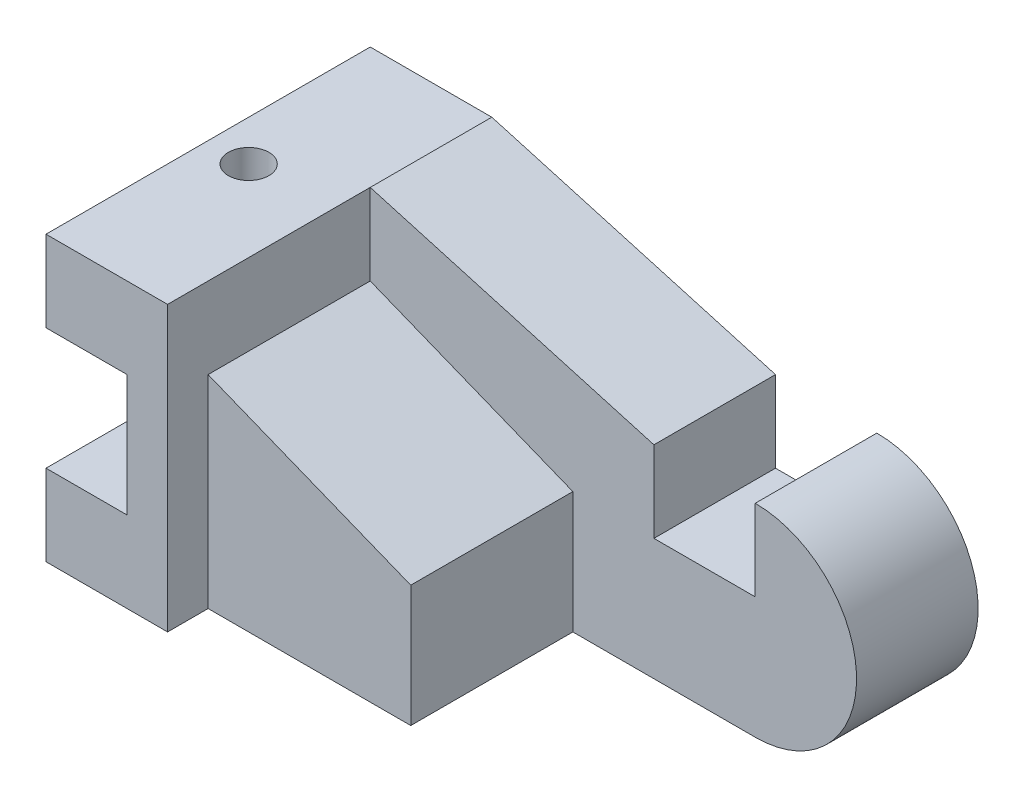
ISO-10303-21;
HEADER;
FILE_DESCRIPTION(('STEP AP214'),'2;1');
FILE_NAME('part.step','',(''),(''),'','','');
FILE_SCHEMA(('AUTOMOTIVE_DESIGN { 1 0 10303 214 1 1 1 1 }'));
ENDSEC;
DATA;
#1=APPLICATION_CONTEXT('core data for automotive mechanical design processes');
#2=APPLICATION_PROTOCOL_DEFINITION('international standard','automotive_design',2000,#1);
#3=PRODUCT_CONTEXT('',#1,'mechanical');
#4=PRODUCT('Part','Part','',(#3));
#5=PRODUCT_RELATED_PRODUCT_CATEGORY('part','',(#4));
#6=PRODUCT_DEFINITION_FORMATION('','',#4);
#7=PRODUCT_DEFINITION_CONTEXT('part definition',#1,'design');
#8=PRODUCT_DEFINITION('design','',#6,#7);
#9=PRODUCT_DEFINITION_SHAPE('','',#8);
#10=(LENGTH_UNIT() NAMED_UNIT(*) SI_UNIT(.MILLI.,.METRE.));
#11=(NAMED_UNIT(*) PLANE_ANGLE_UNIT() SI_UNIT($,.RADIAN.));
#12=(NAMED_UNIT(*) SI_UNIT($,.STERADIAN.) SOLID_ANGLE_UNIT());
#13=UNCERTAINTY_MEASURE_WITH_UNIT(LENGTH_MEASURE(1.E-05),#10,'distance_accuracy_value','');
#14=(GEOMETRIC_REPRESENTATION_CONTEXT(3) GLOBAL_UNCERTAINTY_ASSIGNED_CONTEXT((#13)) GLOBAL_UNIT_ASSIGNED_CONTEXT((#10,
#11,#12)) REPRESENTATION_CONTEXT('',''));
#15=CARTESIAN_POINT('',(0.,0.,0.));
#16=DIRECTION('',(0.,0.,1.));
#17=DIRECTION('',(1.,0.,0.));
#18=AXIS2_PLACEMENT_3D('',#15,#16,#17);
#19=CARTESIAN_POINT('',(0.,70.,40.));
#20=DIRECTION('',(0.,-1.,0.));
#21=DIRECTION('',(0.,0.,-1.));
#22=AXIS2_PLACEMENT_3D('',#19,#20,#21);
#23=PLANE('',#22);
#24=DIRECTION('',(-1.,0.,0.));
#25=VECTOR('',#24,1.);
#26=CARTESIAN_POINT('',(0.,70.,-40.));
#27=LINE('',#26,#25);
#28=CARTESIAN_POINT('',(0.,70.,-40.));
#29=VERTEX_POINT('',#28);
#30=CARTESIAN_POINT('',(-30.,70.,-40.));
#31=VERTEX_POINT('',#30);
#32=EDGE_CURVE('E234',#29,#31,#27,.T.);
#33=ORIENTED_EDGE('',*,*,#32,.T.);
#34=DIRECTION('',(0.,0.,-1.));
#35=VECTOR('',#34,1.);
#36=CARTESIAN_POINT('',(-30.,70.,40.));
#37=LINE('',#36,#35);
#38=CARTESIAN_POINT('',(-30.,70.,40.));
#39=VERTEX_POINT('',#38);
#40=EDGE_CURVE('E49',#39,#31,#37,.T.);
#41=ORIENTED_EDGE('',*,*,#40,.F.);
#42=DIRECTION('',(-1.,0.,0.));
#43=VECTOR('',#42,1.);
#44=CARTESIAN_POINT('',(0.,70.,40.));
#45=LINE('',#44,#43);
#46=CARTESIAN_POINT('',(0.,70.,40.));
#47=VERTEX_POINT('',#46);
#48=EDGE_CURVE('E238',#47,#39,#45,.T.);
#49=ORIENTED_EDGE('',*,*,#48,.F.);
#50=DIRECTION('',(0.,0.,-1.));
#51=VECTOR('',#50,1.);
#52=CARTESIAN_POINT('',(0.,70.,40.));
#53=LINE('',#52,#51);
#54=CARTESIAN_POINT('',(0.,70.,-10.));
#55=VERTEX_POINT('',#54);
#56=EDGE_CURVE('E11',#47,#55,#53,.T.);
#57=ORIENTED_EDGE('',*,*,#56,.T.);
#58=DIRECTION('',(0.,0.,-1.));
#59=VECTOR('',#58,1.);
#60=CARTESIAN_POINT('',(0.,70.,-10.));
#61=LINE('',#60,#59);
#62=EDGE_CURVE('E208',#55,#29,#61,.T.);
#63=ORIENTED_EDGE('',*,*,#62,.T.);
#64=EDGE_LOOP('',(#33,#41,#49,#57,#63));
#65=FACE_BOUND('',#64,.T.);
#66=CARTESIAN_POINT('',(-20.,70.,0.));
#67=DIRECTION('',(0.,1.,0.));
#68=DIRECTION('',(0.,0.,1.));
#69=AXIS2_PLACEMENT_3D('',#66,#67,#68);
#70=CIRCLE('',#69,4.99999999999999);
#71=CARTESIAN_POINT('',(-20.,70.,4.99999999999999));
#72=VERTEX_POINT('',#71);
#73=EDGE_CURVE('E368',#72,#72,#70,.T.);
#74=ORIENTED_EDGE('',*,*,#73,.F.);
#75=EDGE_LOOP('',(#74));
#76=FACE_BOUND('',#75,.T.);
#77=ADVANCED_FACE('F41',(#65,#76),#23,.F.);
#78=CARTESIAN_POINT('',(0.,0.,40.));
#79=DIRECTION('',(-1.,0.,0.));
#80=DIRECTION('',(0.,0.,1.));
#81=AXIS2_PLACEMENT_3D('',#78,#79,#80);
#82=PLANE('',#81);
#83=DIRECTION('',(0.,0.,-1.));
#84=VECTOR('',#83,1.);
#85=CARTESIAN_POINT('',(0.,50.,30.));
#86=LINE('',#85,#84);
#87=CARTESIAN_POINT('',(0.,50.,30.));
#88=VERTEX_POINT('',#87);
#89=CARTESIAN_POINT('',(0.,50.,-10.));
#90=VERTEX_POINT('',#89);
#91=EDGE_CURVE('E171',#88,#90,#86,.T.);
#92=ORIENTED_EDGE('',*,*,#91,.T.);
#93=DIRECTION('',(0.,1.,0.));
#94=VECTOR('',#93,1.);
#95=CARTESIAN_POINT('',(0.,0.,-10.));
#96=LINE('',#95,#94);
#97=EDGE_CURVE('E64',#90,#55,#96,.T.);
#98=ORIENTED_EDGE('',*,*,#97,.T.);
#99=ORIENTED_EDGE('',*,*,#56,.F.);
#100=DIRECTION('',(0.,1.,0.));
#101=VECTOR('',#100,1.);
#102=CARTESIAN_POINT('',(0.,0.,40.));
#103=LINE('',#102,#101);
#104=CARTESIAN_POINT('',(0.,0.,40.));
#105=VERTEX_POINT('',#104);
#106=EDGE_CURVE('E235',#105,#47,#103,.T.);
#107=ORIENTED_EDGE('',*,*,#106,.F.);
#108=DIRECTION('',(0.,0.,-1.));
#109=VECTOR('',#108,1.);
#110=CARTESIAN_POINT('',(0.,0.,40.));
#111=LINE('',#110,#109);
#112=CARTESIAN_POINT('',(0.,0.,30.));
#113=VERTEX_POINT('',#112);
#114=EDGE_CURVE('E180',#105,#113,#111,.T.);
#115=ORIENTED_EDGE('',*,*,#114,.T.);
#116=DIRECTION('',(0.,-1.,0.));
#117=VECTOR('',#116,1.);
#118=CARTESIAN_POINT('',(0.,50.,30.));
#119=LINE('',#118,#117);
#120=EDGE_CURVE('E163',#88,#113,#119,.T.);
#121=ORIENTED_EDGE('',*,*,#120,.F.);
#122=EDGE_LOOP('',(#92,#98,#99,#107,#115,#121));
#123=FACE_BOUND('',#122,.T.);
#124=ADVANCED_FACE('F43',(#123),#82,.F.);
#125=CARTESIAN_POINT('',(0.,0.,-10.));
#126=DIRECTION('',(0.,0.,1.));
#127=DIRECTION('',(1.,0.,0.));
#128=AXIS2_PLACEMENT_3D('',#125,#126,#127);
#129=PLANE('',#128);
#130=ORIENTED_EDGE('',*,*,#97,.F.);
#131=DIRECTION('',(-0.928476690885259,0.371390676354104,0.));
#132=VECTOR('',#131,1.);
#133=CARTESIAN_POINT('',(50.,30.,-10.));
#134=LINE('',#133,#132);
#135=CARTESIAN_POINT('',(50.,30.,-10.));
#136=VERTEX_POINT('',#135);
#137=EDGE_CURVE('E174',#136,#90,#134,.T.);
#138=ORIENTED_EDGE('',*,*,#137,.F.);
#139=DIRECTION('',(0.,1.,0.));
#140=VECTOR('',#139,1.);
#141=CARTESIAN_POINT('',(50.,0.,-10.));
#142=LINE('',#141,#140);
#143=CARTESIAN_POINT('',(50.,0.,-10.));
#144=VERTEX_POINT('',#143);
#145=EDGE_CURVE('E169',#144,#136,#142,.T.);
#146=ORIENTED_EDGE('',*,*,#145,.F.);
#147=DIRECTION('',(1.,0.,0.));
#148=VECTOR('',#147,1.);
#149=CARTESIAN_POINT('',(0.,0.,-10.));
#150=LINE('',#149,#148);
#151=CARTESIAN_POINT('',(95.,0.,-10.));
#152=VERTEX_POINT('',#151);
#153=EDGE_CURVE('E193',#144,#152,#150,.T.);
#154=ORIENTED_EDGE('',*,*,#153,.T.);
#155=CARTESIAN_POINT('',(95.,25.,-10.));
#156=DIRECTION('',(0.,0.,1.));
#157=DIRECTION('',(1.,0.,0.));
#158=AXIS2_PLACEMENT_3D('',#155,#156,#157);
#159=CIRCLE('',#158,25.);
#160=CARTESIAN_POINT('',(95.,50.,-10.));
#161=VERTEX_POINT('',#160);
#162=EDGE_CURVE('E195',#152,#161,#159,.T.);
#163=ORIENTED_EDGE('',*,*,#162,.T.);
#164=DIRECTION('',(0.,-1.,0.));
#165=VECTOR('',#164,1.);
#166=CARTESIAN_POINT('',(95.,0.,-10.));
#167=LINE('',#166,#165);
#168=CARTESIAN_POINT('',(95.,30.,-10.));
#169=VERTEX_POINT('',#168);
#170=EDGE_CURVE('E198',#161,#169,#167,.T.);
#171=ORIENTED_EDGE('',*,*,#170,.T.);
#172=DIRECTION('',(-1.,0.,0.));
#173=VECTOR('',#172,1.);
#174=CARTESIAN_POINT('',(0.,30.,-10.));
#175=LINE('',#174,#173);
#176=CARTESIAN_POINT('',(70.,30.,-10.));
#177=VERTEX_POINT('',#176);
#178=EDGE_CURVE('E200',#169,#177,#175,.T.);
#179=ORIENTED_EDGE('',*,*,#178,.T.);
#180=DIRECTION('',(0.,1.,0.));
#181=VECTOR('',#180,1.);
#182=CARTESIAN_POINT('',(70.,0.,-10.));
#183=LINE('',#182,#181);
#184=CARTESIAN_POINT('',(70.,50.,-10.));
#185=VERTEX_POINT('',#184);
#186=EDGE_CURVE('E202',#177,#185,#183,.T.);
#187=ORIENTED_EDGE('',*,*,#186,.T.);
#188=DIRECTION('',(-0.961523947640823,0.274721127897378,0.));
#189=VECTOR('',#188,1.);
#190=CARTESIAN_POINT('',(18.4905660377359,64.7169811320755,-10.));
#191=LINE('',#190,#189);
#192=EDGE_CURVE('E204',#185,#55,#191,.T.);
#193=ORIENTED_EDGE('',*,*,#192,.T.);
#194=EDGE_LOOP('',(#130,#138,#146,#154,#163,#171,#179,#187,#193));
#195=FACE_BOUND('',#194,.T.);
#196=ADVANCED_FACE('F312',(#195),#129,.T.);
#197=CARTESIAN_POINT('',(-30.,0.,40.));
#198=DIRECTION('',(1.,0.,0.));
#199=DIRECTION('',(0.,1.,0.));
#200=AXIS2_PLACEMENT_3D('',#197,#198,#199);
#201=PLANE('',#200);
#202=DIRECTION('',(0.,-1.,0.));
#203=VECTOR('',#202,1.);
#204=CARTESIAN_POINT('',(-30.,0.,-40.));
#205=LINE('',#204,#203);
#206=CARTESIAN_POINT('',(-30.,50.,-40.));
#207=VERTEX_POINT('',#206);
#208=EDGE_CURVE('E254',#31,#207,#205,.T.);
#209=ORIENTED_EDGE('',*,*,#208,.T.);
#210=DIRECTION('',(0.,0.,-1.));
#211=VECTOR('',#210,1.);
#212=CARTESIAN_POINT('',(-30.,50.,40.));
#213=LINE('',#212,#211);
#214=CARTESIAN_POINT('',(-30.,50.,40.));
#215=VERTEX_POINT('',#214);
#216=EDGE_CURVE('E278',#215,#207,#213,.T.);
#217=ORIENTED_EDGE('',*,*,#216,.F.);
#218=DIRECTION('',(0.,-1.,0.));
#219=VECTOR('',#218,1.);
#220=CARTESIAN_POINT('',(-30.,0.,40.));
#221=LINE('',#220,#219);
#222=EDGE_CURVE('E241',#39,#215,#221,.T.);
#223=ORIENTED_EDGE('',*,*,#222,.F.);
#224=ORIENTED_EDGE('',*,*,#40,.T.);
#225=EDGE_LOOP('',(#209,#217,#223,#224));
#226=FACE_BOUND('',#225,.T.);
#227=ADVANCED_FACE('F285',(#226),#201,.F.);
#228=CARTESIAN_POINT('',(0.,50.,40.));
#229=DIRECTION('',(0.,1.,0.));
#230=DIRECTION('',(0.,0.,1.));
#231=AXIS2_PLACEMENT_3D('',#228,#229,#230);
#232=PLANE('',#231);
#233=CARTESIAN_POINT('',(-20.,50.,0.));
#234=DIRECTION('',(0.,1.,0.));
#235=DIRECTION('',(0.,0.,1.));
#236=AXIS2_PLACEMENT_3D('',#233,#234,#235);
#237=CIRCLE('',#236,4.99999999999999);
#238=CARTESIAN_POINT('',(-20.,50.,4.99999999999999));
#239=VERTEX_POINT('',#238);
#240=EDGE_CURVE('E189',#239,#239,#237,.T.);
#241=ORIENTED_EDGE('',*,*,#240,.T.);
#242=EDGE_LOOP('',(#241));
#243=FACE_BOUND('',#242,.T.);
#244=DIRECTION('',(1.,0.,0.));
#245=VECTOR('',#244,1.);
#246=CARTESIAN_POINT('',(0.,50.,-40.));
#247=LINE('',#246,#245);
#248=CARTESIAN_POINT('',(-10.,50.,-40.));
#249=VERTEX_POINT('',#248);
#250=EDGE_CURVE('E256',#207,#249,#247,.T.);
#251=ORIENTED_EDGE('',*,*,#250,.T.);
#252=DIRECTION('',(0.,0.,-1.));
#253=VECTOR('',#252,1.);
#254=CARTESIAN_POINT('',(-10.,50.,40.));
#255=LINE('',#254,#253);
#256=CARTESIAN_POINT('',(-10.,50.,40.));
#257=VERTEX_POINT('',#256);
#258=EDGE_CURVE('E275',#257,#249,#255,.T.);
#259=ORIENTED_EDGE('',*,*,#258,.F.);
#260=DIRECTION('',(1.,0.,0.));
#261=VECTOR('',#260,1.);
#262=CARTESIAN_POINT('',(0.,50.,40.));
#263=LINE('',#262,#261);
#264=EDGE_CURVE('E243',#215,#257,#263,.T.);
#265=ORIENTED_EDGE('',*,*,#264,.F.);
#266=ORIENTED_EDGE('',*,*,#216,.T.);
#267=EDGE_LOOP('',(#251,#259,#265,#266));
#268=FACE_BOUND('',#267,.T.);
#269=ADVANCED_FACE('F297',(#243,#268),#232,.F.);
#270=CARTESIAN_POINT('',(-10.,0.,40.));
#271=DIRECTION('',(1.,0.,0.));
#272=DIRECTION('',(0.,1.,0.));
#273=AXIS2_PLACEMENT_3D('',#270,#271,#272);
#274=PLANE('',#273);
#275=DIRECTION('',(0.,-1.,0.));
#276=VECTOR('',#275,1.);
#277=CARTESIAN_POINT('',(-10.,0.,-40.));
#278=LINE('',#277,#276);
#279=CARTESIAN_POINT('',(-10.,20.,-40.));
#280=VERTEX_POINT('',#279);
#281=EDGE_CURVE('E258',#249,#280,#278,.T.);
#282=ORIENTED_EDGE('',*,*,#281,.T.);
#283=DIRECTION('',(0.,0.,-1.));
#284=VECTOR('',#283,1.);
#285=CARTESIAN_POINT('',(-10.,20.,40.));
#286=LINE('',#285,#284);
#287=CARTESIAN_POINT('',(-10.,20.,40.));
#288=VERTEX_POINT('',#287);
#289=EDGE_CURVE('E272',#288,#280,#286,.T.);
#290=ORIENTED_EDGE('',*,*,#289,.F.);
#291=DIRECTION('',(0.,-1.,0.));
#292=VECTOR('',#291,1.);
#293=CARTESIAN_POINT('',(-10.,0.,40.));
#294=LINE('',#293,#292);
#295=EDGE_CURVE('E245',#257,#288,#294,.T.);
#296=ORIENTED_EDGE('',*,*,#295,.F.);
#297=ORIENTED_EDGE('',*,*,#258,.T.);
#298=EDGE_LOOP('',(#282,#290,#296,#297));
#299=FACE_BOUND('',#298,.T.);
#300=ADVANCED_FACE('F301',(#299),#274,.F.);
#301=CARTESIAN_POINT('',(0.,20.,40.));
#302=DIRECTION('',(0.,-1.,0.));
#303=DIRECTION('',(1.,0.,0.));
#304=AXIS2_PLACEMENT_3D('',#301,#302,#303);
#305=PLANE('',#304);
#306=DIRECTION('',(-1.,0.,0.));
#307=VECTOR('',#306,1.);
#308=CARTESIAN_POINT('',(0.,20.,-40.));
#309=LINE('',#308,#307);
#310=CARTESIAN_POINT('',(-30.,20.,-40.));
#311=VERTEX_POINT('',#310);
#312=EDGE_CURVE('E260',#280,#311,#309,.T.);
#313=ORIENTED_EDGE('',*,*,#312,.T.);
#314=DIRECTION('',(0.,0.,-1.));
#315=VECTOR('',#314,1.);
#316=CARTESIAN_POINT('',(-30.,20.,40.));
#317=LINE('',#316,#315);
#318=CARTESIAN_POINT('',(-30.,20.,40.));
#319=VERTEX_POINT('',#318);
#320=EDGE_CURVE('E269',#319,#311,#317,.T.);
#321=ORIENTED_EDGE('',*,*,#320,.F.);
#322=DIRECTION('',(-1.,0.,0.));
#323=VECTOR('',#322,1.);
#324=CARTESIAN_POINT('',(0.,20.,40.));
#325=LINE('',#324,#323);
#326=EDGE_CURVE('E247',#288,#319,#325,.T.);
#327=ORIENTED_EDGE('',*,*,#326,.F.);
#328=ORIENTED_EDGE('',*,*,#289,.T.);
#329=EDGE_LOOP('',(#313,#321,#327,#328));
#330=FACE_BOUND('',#329,.T.);
#331=ADVANCED_FACE('F345',(#330),#305,.F.);
#332=CARTESIAN_POINT('',(-30.,0.,40.));
#333=DIRECTION('',(1.,0.,0.));
#334=DIRECTION('',(0.,1.,0.));
#335=AXIS2_PLACEMENT_3D('',#332,#333,#334);
#336=PLANE('',#335);
#337=DIRECTION('',(0.,-1.,0.));
#338=VECTOR('',#337,1.);
#339=CARTESIAN_POINT('',(-30.,0.,-40.));
#340=LINE('',#339,#338);
#341=CARTESIAN_POINT('',(-30.,0.,-40.));
#342=VERTEX_POINT('',#341);
#343=EDGE_CURVE('E262',#311,#342,#340,.T.);
#344=ORIENTED_EDGE('',*,*,#343,.T.);
#345=DIRECTION('',(0.,0.,-1.));
#346=VECTOR('',#345,1.);
#347=CARTESIAN_POINT('',(-30.,0.,40.));
#348=LINE('',#347,#346);
#349=CARTESIAN_POINT('',(-30.,0.,40.));
#350=VERTEX_POINT('',#349);
#351=EDGE_CURVE('E266',#350,#342,#348,.T.);
#352=ORIENTED_EDGE('',*,*,#351,.F.);
#353=DIRECTION('',(0.,-1.,0.));
#354=VECTOR('',#353,1.);
#355=CARTESIAN_POINT('',(-30.,0.,40.));
#356=LINE('',#355,#354);
#357=EDGE_CURVE('E249',#319,#350,#356,.T.);
#358=ORIENTED_EDGE('',*,*,#357,.F.);
#359=ORIENTED_EDGE('',*,*,#320,.T.);
#360=EDGE_LOOP('',(#344,#352,#358,#359));
#361=FACE_BOUND('',#360,.T.);
#362=ADVANCED_FACE('F343',(#361),#336,.F.);
#363=CARTESIAN_POINT('',(0.,0.,40.));
#364=DIRECTION('',(0.,1.,0.));
#365=DIRECTION('',(0.,0.,1.));
#366=AXIS2_PLACEMENT_3D('',#363,#364,#365);
#367=PLANE('',#366);
#368=DIRECTION('',(1.,0.,0.));
#369=VECTOR('',#368,1.);
#370=CARTESIAN_POINT('',(0.,0.,-40.));
#371=LINE('',#370,#369);
#372=CARTESIAN_POINT('',(95.,0.,-40.));
#373=VERTEX_POINT('',#372);
#374=EDGE_CURVE('E239',#342,#373,#371,.T.);
#375=ORIENTED_EDGE('',*,*,#374,.T.);
#376=DIRECTION('',(0.,0.,-1.));
#377=VECTOR('',#376,1.);
#378=CARTESIAN_POINT('',(95.,0.,-10.));
#379=LINE('',#378,#377);
#380=EDGE_CURVE('E231',#152,#373,#379,.T.);
#381=ORIENTED_EDGE('',*,*,#380,.F.);
#382=ORIENTED_EDGE('',*,*,#153,.F.);
#383=DIRECTION('',(0.,0.,-1.));
#384=VECTOR('',#383,1.);
#385=CARTESIAN_POINT('',(50.,0.,30.));
#386=LINE('',#385,#384);
#387=CARTESIAN_POINT('',(50.,0.,30.));
#388=VERTEX_POINT('',#387);
#389=EDGE_CURVE('E56',#388,#144,#386,.T.);
#390=ORIENTED_EDGE('',*,*,#389,.F.);
#391=DIRECTION('',(1.,0.,0.));
#392=VECTOR('',#391,1.);
#393=CARTESIAN_POINT('',(0.,0.,30.));
#394=LINE('',#393,#392);
#395=EDGE_CURVE('E181',#113,#388,#394,.T.);
#396=ORIENTED_EDGE('',*,*,#395,.F.);
#397=ORIENTED_EDGE('',*,*,#114,.F.);
#398=DIRECTION('',(1.,0.,0.));
#399=VECTOR('',#398,1.);
#400=CARTESIAN_POINT('',(0.,0.,40.));
#401=LINE('',#400,#399);
#402=EDGE_CURVE('E251',#350,#105,#401,.T.);
#403=ORIENTED_EDGE('',*,*,#402,.F.);
#404=ORIENTED_EDGE('',*,*,#351,.T.);
#405=EDGE_LOOP('',(#375,#381,#382,#390,#396,#397,#403,#404));
#406=FACE_BOUND('',#405,.T.);
#407=ADVANCED_FACE('F337',(#406),#367,.F.);
#408=CARTESIAN_POINT('',(0.,0.,40.));
#409=DIRECTION('',(0.,0.,1.));
#410=DIRECTION('',(1.,0.,0.));
#411=AXIS2_PLACEMENT_3D('',#408,#409,#410);
#412=PLANE('',#411);
#413=ORIENTED_EDGE('',*,*,#106,.T.);
#414=ORIENTED_EDGE('',*,*,#48,.T.);
#415=ORIENTED_EDGE('',*,*,#222,.T.);
#416=ORIENTED_EDGE('',*,*,#264,.T.);
#417=ORIENTED_EDGE('',*,*,#295,.T.);
#418=ORIENTED_EDGE('',*,*,#326,.T.);
#419=ORIENTED_EDGE('',*,*,#357,.T.);
#420=ORIENTED_EDGE('',*,*,#402,.T.);
#421=EDGE_LOOP('',(#413,#414,#415,#416,#417,#418,#419,#420));
#422=FACE_BOUND('',#421,.T.);
#423=ADVANCED_FACE('F305',(#422),#412,.T.);
#424=CARTESIAN_POINT('',(0.,0.,-40.));
#425=DIRECTION('',(0.,0.,1.));
#426=DIRECTION('',(1.,0.,0.));
#427=AXIS2_PLACEMENT_3D('',#424,#425,#426);
#428=PLANE('',#427);
#429=ORIENTED_EDGE('',*,*,#32,.F.);
#430=DIRECTION('',(-0.961523947640823,0.274721127897378,0.));
#431=VECTOR('',#430,1.);
#432=CARTESIAN_POINT('',(18.4905660377359,64.7169811320755,-40.));
#433=LINE('',#432,#431);
#434=CARTESIAN_POINT('',(70.,50.,-40.));
#435=VERTEX_POINT('',#434);
#436=EDGE_CURVE('E196',#435,#29,#433,.T.);
#437=ORIENTED_EDGE('',*,*,#436,.F.);
#438=DIRECTION('',(0.,1.,0.));
#439=VECTOR('',#438,1.);
#440=CARTESIAN_POINT('',(70.,0.,-40.));
#441=LINE('',#440,#439);
#442=CARTESIAN_POINT('',(70.,30.,-40.));
#443=VERTEX_POINT('',#442);
#444=EDGE_CURVE('E214',#443,#435,#441,.T.);
#445=ORIENTED_EDGE('',*,*,#444,.F.);
#446=DIRECTION('',(-1.,0.,0.));
#447=VECTOR('',#446,1.);
#448=CARTESIAN_POINT('',(0.,30.,-40.));
#449=LINE('',#448,#447);
#450=CARTESIAN_POINT('',(95.,30.,-40.));
#451=VERTEX_POINT('',#450);
#452=EDGE_CURVE('E212',#451,#443,#449,.T.);
#453=ORIENTED_EDGE('',*,*,#452,.F.);
#454=DIRECTION('',(0.,-1.,0.));
#455=VECTOR('',#454,1.);
#456=CARTESIAN_POINT('',(95.,0.,-40.));
#457=LINE('',#456,#455);
#458=CARTESIAN_POINT('',(95.,50.,-40.));
#459=VERTEX_POINT('',#458);
#460=EDGE_CURVE('E210',#459,#451,#457,.T.);
#461=ORIENTED_EDGE('',*,*,#460,.F.);
#462=CARTESIAN_POINT('',(95.,25.,-40.));
#463=DIRECTION('',(0.,0.,1.));
#464=DIRECTION('',(1.,0.,0.));
#465=AXIS2_PLACEMENT_3D('',#462,#463,#464);
#466=CIRCLE('',#465,25.);
#467=EDGE_CURVE('E175',#373,#459,#466,.T.);
#468=ORIENTED_EDGE('',*,*,#467,.F.);
#469=ORIENTED_EDGE('',*,*,#374,.F.);
#470=ORIENTED_EDGE('',*,*,#343,.F.);
#471=ORIENTED_EDGE('',*,*,#312,.F.);
#472=ORIENTED_EDGE('',*,*,#281,.F.);
#473=ORIENTED_EDGE('',*,*,#250,.F.);
#474=ORIENTED_EDGE('',*,*,#208,.F.);
#475=EDGE_LOOP('',(#429,#437,#445,#453,#461,#468,#469,#470,#471,#472,#473,#474));
#476=FACE_BOUND('',#475,.T.);
#477=ADVANCED_FACE('F291',(#476),#428,.F.);
#478=CARTESIAN_POINT('',(95.,25.,-10.));
#479=DIRECTION('',(0.,0.,-1.));
#480=DIRECTION('',(-1.,0.,0.));
#481=AXIS2_PLACEMENT_3D('',#478,#479,#480);
#482=CYLINDRICAL_SURFACE('',#481,25.);
#483=ORIENTED_EDGE('',*,*,#467,.T.);
#484=DIRECTION('',(0.,0.,-1.));
#485=VECTOR('',#484,1.);
#486=CARTESIAN_POINT('',(95.,50.,-10.));
#487=LINE('',#486,#485);
#488=EDGE_CURVE('E228',#161,#459,#487,.T.);
#489=ORIENTED_EDGE('',*,*,#488,.F.);
#490=ORIENTED_EDGE('',*,*,#162,.F.);
#491=ORIENTED_EDGE('',*,*,#380,.T.);
#492=EDGE_LOOP('',(#483,#489,#490,#491));
#493=FACE_BOUND('',#492,.T.);
#494=ADVANCED_FACE('F332',(#493),#482,.T.);
#495=CARTESIAN_POINT('',(95.,0.,-10.));
#496=DIRECTION('',(1.,0.,0.));
#497=DIRECTION('',(0.,0.,-1.));
#498=AXIS2_PLACEMENT_3D('',#495,#496,#497);
#499=PLANE('',#498);
#500=ORIENTED_EDGE('',*,*,#460,.T.);
#501=DIRECTION('',(0.,0.,-1.));
#502=VECTOR('',#501,1.);
#503=CARTESIAN_POINT('',(95.,30.,-10.));
#504=LINE('',#503,#502);
#505=EDGE_CURVE('E225',#169,#451,#504,.T.);
#506=ORIENTED_EDGE('',*,*,#505,.F.);
#507=ORIENTED_EDGE('',*,*,#170,.F.);
#508=ORIENTED_EDGE('',*,*,#488,.T.);
#509=EDGE_LOOP('',(#500,#506,#507,#508));
#510=FACE_BOUND('',#509,.T.);
#511=ADVANCED_FACE('F328',(#510),#499,.F.);
#512=CARTESIAN_POINT('',(0.,30.,-10.));
#513=DIRECTION('',(0.,-1.,0.));
#514=DIRECTION('',(1.,0.,0.));
#515=AXIS2_PLACEMENT_3D('',#512,#513,#514);
#516=PLANE('',#515);
#517=ORIENTED_EDGE('',*,*,#452,.T.);
#518=DIRECTION('',(0.,0.,-1.));
#519=VECTOR('',#518,1.);
#520=CARTESIAN_POINT('',(70.,30.,-10.));
#521=LINE('',#520,#519);
#522=EDGE_CURVE('E222',#177,#443,#521,.T.);
#523=ORIENTED_EDGE('',*,*,#522,.F.);
#524=ORIENTED_EDGE('',*,*,#178,.F.);
#525=ORIENTED_EDGE('',*,*,#505,.T.);
#526=EDGE_LOOP('',(#517,#523,#524,#525));
#527=FACE_BOUND('',#526,.T.);
#528=ADVANCED_FACE('F324',(#527),#516,.F.);
#529=CARTESIAN_POINT('',(70.,0.,-10.));
#530=DIRECTION('',(-1.,0.,0.));
#531=DIRECTION('',(0.,0.,1.));
#532=AXIS2_PLACEMENT_3D('',#529,#530,#531);
#533=PLANE('',#532);
#534=ORIENTED_EDGE('',*,*,#444,.T.);
#535=DIRECTION('',(0.,0.,-1.));
#536=VECTOR('',#535,1.);
#537=CARTESIAN_POINT('',(70.,50.,-10.));
#538=LINE('',#537,#536);
#539=EDGE_CURVE('E219',#185,#435,#538,.T.);
#540=ORIENTED_EDGE('',*,*,#539,.F.);
#541=ORIENTED_EDGE('',*,*,#186,.F.);
#542=ORIENTED_EDGE('',*,*,#522,.T.);
#543=EDGE_LOOP('',(#534,#540,#541,#542));
#544=FACE_BOUND('',#543,.T.);
#545=ADVANCED_FACE('F318',(#544),#533,.F.);
#546=CARTESIAN_POINT('',(18.4905660377359,64.7169811320755,-10.));
#547=DIRECTION('',(-0.274721127897378,-0.961523947640823,0.));
#548=DIRECTION('',(0.961523947640823,-0.274721127897378,0.));
#549=AXIS2_PLACEMENT_3D('',#546,#547,#548);
#550=PLANE('',#549);
#551=ORIENTED_EDGE('',*,*,#436,.T.);
#552=ORIENTED_EDGE('',*,*,#62,.F.);
#553=ORIENTED_EDGE('',*,*,#192,.F.);
#554=ORIENTED_EDGE('',*,*,#539,.T.);
#555=EDGE_LOOP('',(#551,#552,#553,#554));
#556=FACE_BOUND('',#555,.T.);
#557=ADVANCED_FACE('F310',(#556),#550,.F.);
#558=CARTESIAN_POINT('',(50.,30.,30.));
#559=DIRECTION('',(-0.371390676354104,-0.928476690885259,0.));
#560=DIRECTION('',(0.928476690885259,-0.371390676354104,0.));
#561=AXIS2_PLACEMENT_3D('',#558,#559,#560);
#562=PLANE('',#561);
#563=ORIENTED_EDGE('',*,*,#137,.T.);
#564=ORIENTED_EDGE('',*,*,#91,.F.);
#565=DIRECTION('',(-0.928476690885259,0.371390676354104,0.));
#566=VECTOR('',#565,1.);
#567=CARTESIAN_POINT('',(50.,30.,30.));
#568=LINE('',#567,#566);
#569=CARTESIAN_POINT('',(50.,30.,30.));
#570=VERTEX_POINT('',#569);
#571=EDGE_CURVE('E159',#570,#88,#568,.T.);
#572=ORIENTED_EDGE('',*,*,#571,.F.);
#573=DIRECTION('',(0.,0.,-1.));
#574=VECTOR('',#573,1.);
#575=CARTESIAN_POINT('',(50.,30.,30.));
#576=LINE('',#575,#574);
#577=EDGE_CURVE('E187',#570,#136,#576,.T.);
#578=ORIENTED_EDGE('',*,*,#577,.T.);
#579=EDGE_LOOP('',(#563,#564,#572,#578));
#580=FACE_BOUND('',#579,.T.);
#581=ADVANCED_FACE('F172',(#580),#562,.F.);
#582=CARTESIAN_POINT('',(50.,0.,30.));
#583=DIRECTION('',(-1.,0.,0.));
#584=DIRECTION('',(0.,0.,1.));
#585=AXIS2_PLACEMENT_3D('',#582,#583,#584);
#586=PLANE('',#585);
#587=ORIENTED_EDGE('',*,*,#145,.T.);
#588=ORIENTED_EDGE('',*,*,#577,.F.);
#589=DIRECTION('',(0.,1.,0.));
#590=VECTOR('',#589,1.);
#591=CARTESIAN_POINT('',(50.,0.,30.));
#592=LINE('',#591,#590);
#593=EDGE_CURVE('E165',#388,#570,#592,.T.);
#594=ORIENTED_EDGE('',*,*,#593,.F.);
#595=ORIENTED_EDGE('',*,*,#389,.T.);
#596=EDGE_LOOP('',(#587,#588,#594,#595));
#597=FACE_BOUND('',#596,.T.);
#598=ADVANCED_FACE('F379',(#597),#586,.F.);
#599=CARTESIAN_POINT('',(0.,0.,30.));
#600=DIRECTION('',(0.,0.,1.));
#601=DIRECTION('',(1.,0.,0.));
#602=AXIS2_PLACEMENT_3D('',#599,#600,#601);
#603=PLANE('',#602);
#604=ORIENTED_EDGE('',*,*,#571,.T.);
#605=ORIENTED_EDGE('',*,*,#120,.T.);
#606=ORIENTED_EDGE('',*,*,#395,.T.);
#607=ORIENTED_EDGE('',*,*,#593,.T.);
#608=EDGE_LOOP('',(#604,#605,#606,#607));
#609=FACE_BOUND('',#608,.T.);
#610=ADVANCED_FACE('F161',(#609),#603,.T.);
#611=CARTESIAN_POINT('',(-20.,70.,0.));
#612=DIRECTION('',(0.,1.,0.));
#613=DIRECTION('',(0.,0.,1.));
#614=AXIS2_PLACEMENT_3D('',#611,#612,#613);
#615=CYLINDRICAL_SURFACE('',#614,4.99999999999999);
#616=ORIENTED_EDGE('',*,*,#240,.F.);
#617=EDGE_LOOP('',(#616));
#618=FACE_BOUND('',#617,.T.);
#619=ORIENTED_EDGE('',*,*,#73,.T.);
#620=EDGE_LOOP('',(#619));
#621=FACE_BOUND('',#620,.T.);
#622=ADVANCED_FACE('F373',(#618,#621),#615,.F.);
#623=CLOSED_SHELL('',(#77,#124,#196,#227,#269,#300,#331,#362,#407,#423,#477,#494,#511,#528,#545,
#557,#581,#598,#610,#622));
#624=MANIFOLD_SOLID_BREP('B2',#623);
#625=ADVANCED_BREP_SHAPE_REPRESENTATION('',(#18,#624),#14);
#626=SHAPE_DEFINITION_REPRESENTATION(#9,#625);
ENDSEC;
END-ISO-10303-21;
